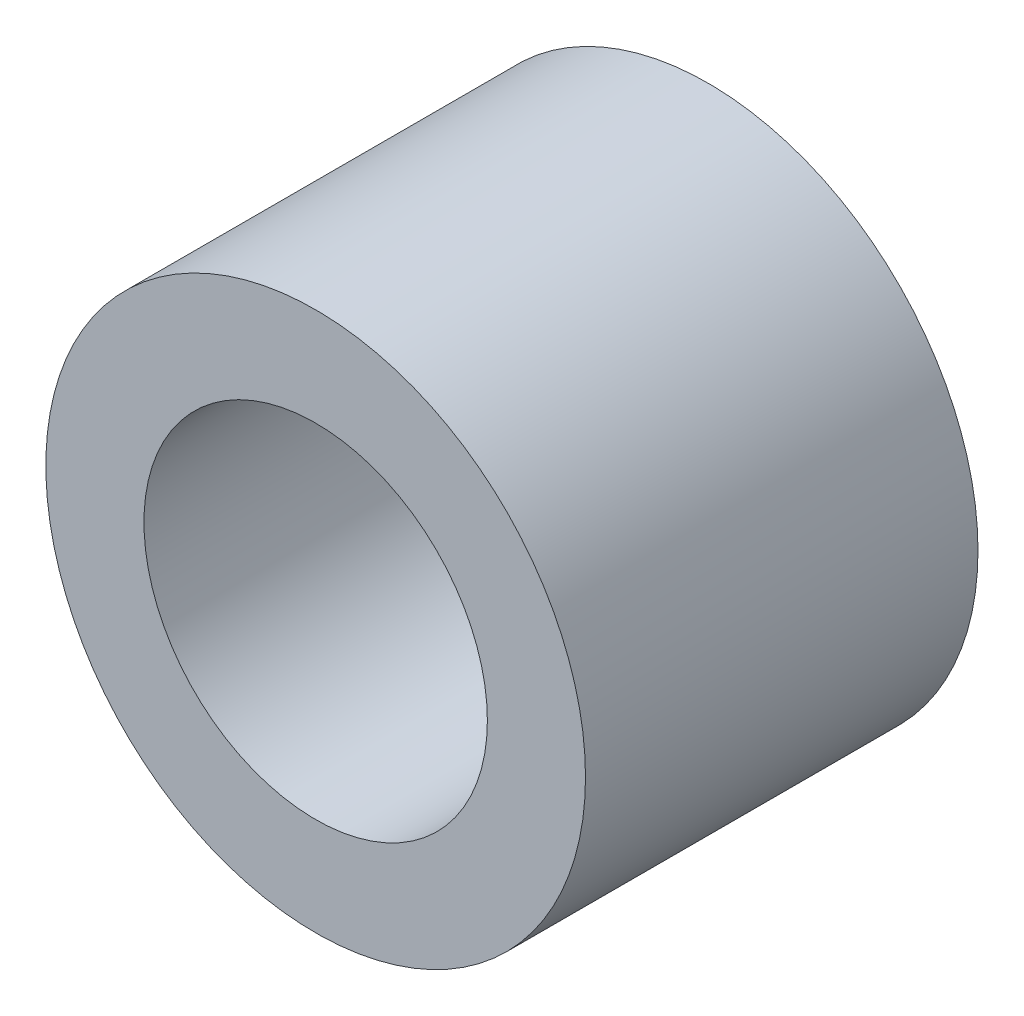
ISO-10303-21;
HEADER;
FILE_DESCRIPTION(('STEP AP214'),'2;1');
FILE_NAME('part.step','',(''),(''),'','','');
FILE_SCHEMA(('AUTOMOTIVE_DESIGN { 1 0 10303 214 1 1 1 1 }'));
ENDSEC;
DATA;
#1=APPLICATION_CONTEXT('core data for automotive mechanical design processes');
#2=APPLICATION_PROTOCOL_DEFINITION('international standard','automotive_design',2000,#1);
#3=PRODUCT_CONTEXT('',#1,'mechanical');
#4=PRODUCT('Part','Part','',(#3));
#5=PRODUCT_RELATED_PRODUCT_CATEGORY('part','',(#4));
#6=PRODUCT_DEFINITION_FORMATION('','',#4);
#7=PRODUCT_DEFINITION_CONTEXT('part definition',#1,'design');
#8=PRODUCT_DEFINITION('design','',#6,#7);
#9=PRODUCT_DEFINITION_SHAPE('','',#8);
#10=(LENGTH_UNIT() NAMED_UNIT(*) SI_UNIT(.MILLI.,.METRE.));
#11=(NAMED_UNIT(*) PLANE_ANGLE_UNIT() SI_UNIT($,.RADIAN.));
#12=(NAMED_UNIT(*) SI_UNIT($,.STERADIAN.) SOLID_ANGLE_UNIT());
#13=UNCERTAINTY_MEASURE_WITH_UNIT(LENGTH_MEASURE(1.E-05),#10,'distance_accuracy_value','');
#14=(GEOMETRIC_REPRESENTATION_CONTEXT(3) GLOBAL_UNCERTAINTY_ASSIGNED_CONTEXT((#13)) GLOBAL_UNIT_ASSIGNED_CONTEXT((#10,
#11,#12)) REPRESENTATION_CONTEXT('',''));
#15=CARTESIAN_POINT('',(0.,0.,0.));
#16=DIRECTION('',(0.,0.,1.));
#17=DIRECTION('',(1.,0.,0.));
#18=AXIS2_PLACEMENT_3D('',#15,#16,#17);
#19=CARTESIAN_POINT('',(0.,0.,4.));
#20=DIRECTION('',(0.,0.,1.));
#21=DIRECTION('',(1.,0.,0.));
#22=AXIS2_PLACEMENT_3D('',#19,#20,#21);
#23=PLANE('',#22);
#24=CARTESIAN_POINT('',(0.,0.,4.));
#25=DIRECTION('',(0.,0.,1.));
#26=DIRECTION('',(1.,0.,0.));
#27=AXIS2_PLACEMENT_3D('',#24,#25,#26);
#28=CIRCLE('',#27,2.75);
#29=CARTESIAN_POINT('',(2.75,0.,4.));
#30=VERTEX_POINT('',#29);
#31=EDGE_CURVE('E10',#30,#30,#28,.T.);
#32=ORIENTED_EDGE('',*,*,#31,.T.);
#33=EDGE_LOOP('',(#32));
#34=FACE_BOUND('',#33,.T.);
#35=CARTESIAN_POINT('',(0.,0.,4.));
#36=DIRECTION('',(0.,0.,1.));
#37=DIRECTION('',(1.,0.,0.));
#38=AXIS2_PLACEMENT_3D('',#35,#36,#37);
#39=CIRCLE('',#38,1.75);
#40=CARTESIAN_POINT('',(1.75,0.,4.));
#41=VERTEX_POINT('',#40);
#42=EDGE_CURVE('E56',#41,#41,#39,.T.);
#43=ORIENTED_EDGE('',*,*,#42,.F.);
#44=EDGE_LOOP('',(#43));
#45=FACE_BOUND('',#44,.T.);
#46=ADVANCED_FACE('F43',(#34,#45),#23,.T.);
#47=CARTESIAN_POINT('',(0.,0.,0.));
#48=DIRECTION('',(0.,0.,1.));
#49=DIRECTION('',(1.,0.,0.));
#50=AXIS2_PLACEMENT_3D('',#47,#48,#49);
#51=PLANE('',#50);
#52=CARTESIAN_POINT('',(0.,0.,0.));
#53=DIRECTION('',(0.,0.,1.));
#54=DIRECTION('',(1.,0.,0.));
#55=AXIS2_PLACEMENT_3D('',#52,#53,#54);
#56=CIRCLE('',#55,2.75);
#57=CARTESIAN_POINT('',(2.75,0.,0.));
#58=VERTEX_POINT('',#57);
#59=EDGE_CURVE('E47',#58,#58,#56,.T.);
#60=ORIENTED_EDGE('',*,*,#59,.F.);
#61=EDGE_LOOP('',(#60));
#62=FACE_BOUND('',#61,.T.);
#63=CARTESIAN_POINT('',(0.,0.,0.));
#64=DIRECTION('',(0.,0.,1.));
#65=DIRECTION('',(1.,0.,0.));
#66=AXIS2_PLACEMENT_3D('',#63,#64,#65);
#67=CIRCLE('',#66,1.75);
#68=CARTESIAN_POINT('',(1.75,0.,0.));
#69=VERTEX_POINT('',#68);
#70=EDGE_CURVE('E58',#69,#69,#67,.T.);
#71=ORIENTED_EDGE('',*,*,#70,.T.);
#72=EDGE_LOOP('',(#71));
#73=FACE_BOUND('',#72,.T.);
#74=ADVANCED_FACE('F70',(#62,#73),#51,.F.);
#75=CARTESIAN_POINT('',(0.,0.,4.));
#76=DIRECTION('',(0.,0.,-1.));
#77=DIRECTION('',(-1.,0.,0.));
#78=AXIS2_PLACEMENT_3D('',#75,#76,#77);
#79=CYLINDRICAL_SURFACE('',#78,2.75);
#80=ORIENTED_EDGE('',*,*,#31,.F.);
#81=EDGE_LOOP('',(#80));
#82=FACE_BOUND('',#81,.T.);
#83=ORIENTED_EDGE('',*,*,#59,.T.);
#84=EDGE_LOOP('',(#83));
#85=FACE_BOUND('',#84,.T.);
#86=ADVANCED_FACE('F45',(#82,#85),#79,.T.);
#87=CARTESIAN_POINT('',(0.,0.,4.));
#88=DIRECTION('',(0.,0.,-1.));
#89=DIRECTION('',(-1.,0.,0.));
#90=AXIS2_PLACEMENT_3D('',#87,#88,#89);
#91=CYLINDRICAL_SURFACE('',#90,1.75);
#92=ORIENTED_EDGE('',*,*,#42,.T.);
#93=EDGE_LOOP('',(#92));
#94=FACE_BOUND('',#93,.T.);
#95=ORIENTED_EDGE('',*,*,#70,.F.);
#96=EDGE_LOOP('',(#95));
#97=FACE_BOUND('',#96,.T.);
#98=ADVANCED_FACE('F66',(#94,#97),#91,.F.);
#99=CLOSED_SHELL('',(#46,#74,#86,#98));
#100=MANIFOLD_SOLID_BREP('B2',#99);
#101=ADVANCED_BREP_SHAPE_REPRESENTATION('',(#18,#100),#14);
#102=SHAPE_DEFINITION_REPRESENTATION(#9,#101);
ENDSEC;
END-ISO-10303-21;
